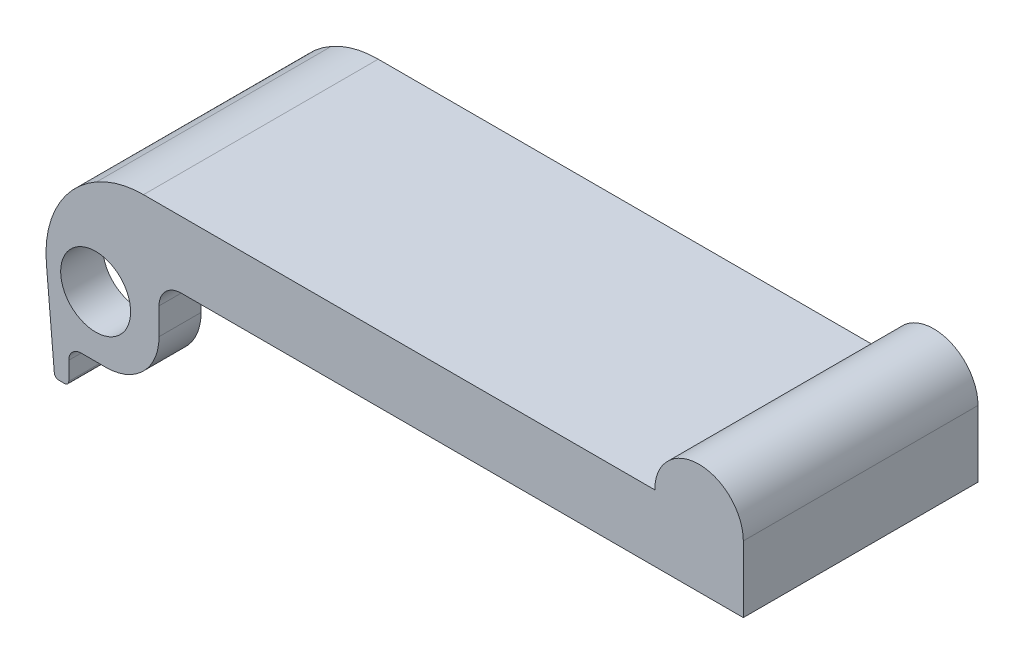
ISO-10303-21;
HEADER;
FILE_DESCRIPTION(('STEP AP214'),'2;1');
FILE_NAME('part.step','',(''),(''),'','','');
FILE_SCHEMA(('AUTOMOTIVE_DESIGN { 1 0 10303 214 1 1 1 1 }'));
ENDSEC;
DATA;
#1=APPLICATION_CONTEXT('core data for automotive mechanical design processes');
#2=APPLICATION_PROTOCOL_DEFINITION('international standard','automotive_design',2000,#1);
#3=PRODUCT_CONTEXT('',#1,'mechanical');
#4=PRODUCT('Part','Part','',(#3));
#5=PRODUCT_RELATED_PRODUCT_CATEGORY('part','',(#4));
#6=PRODUCT_DEFINITION_FORMATION('','',#4);
#7=PRODUCT_DEFINITION_CONTEXT('part definition',#1,'design');
#8=PRODUCT_DEFINITION('design','',#6,#7);
#9=PRODUCT_DEFINITION_SHAPE('','',#8);
#10=(LENGTH_UNIT() NAMED_UNIT(*) SI_UNIT(.MILLI.,.METRE.));
#11=(NAMED_UNIT(*) PLANE_ANGLE_UNIT() SI_UNIT($,.RADIAN.));
#12=(NAMED_UNIT(*) SI_UNIT($,.STERADIAN.) SOLID_ANGLE_UNIT());
#13=UNCERTAINTY_MEASURE_WITH_UNIT(LENGTH_MEASURE(1.E-05),#10,'distance_accuracy_value','');
#14=(GEOMETRIC_REPRESENTATION_CONTEXT(3) GLOBAL_UNCERTAINTY_ASSIGNED_CONTEXT((#13)) GLOBAL_UNIT_ASSIGNED_CONTEXT((#10,
#11,#12)) REPRESENTATION_CONTEXT('',''));
#15=CARTESIAN_POINT('',(0.,0.,0.));
#16=DIRECTION('',(0.,0.,1.));
#17=DIRECTION('',(1.,0.,0.));
#18=AXIS2_PLACEMENT_3D('',#15,#16,#17);
#19=CARTESIAN_POINT('',(0.327576825053643,-0.324192991626943,2.65));
#20=DIRECTION('',(0.,0.,-1.));
#21=DIRECTION('',(-1.,0.,0.));
#22=AXIS2_PLACEMENT_3D('',#19,#20,#21);
#23=CYLINDRICAL_SURFACE('',#22,1.07419299162694);
#24=CARTESIAN_POINT('',(0.327576825053643,-0.324192991626943,2.65));
#25=DIRECTION('',(0.,0.,-1.));
#26=DIRECTION('',(-1.,0.,0.));
#27=AXIS2_PLACEMENT_3D('',#24,#25,#26);
#28=CIRCLE('',#27,1.07419299162694);
#29=CARTESIAN_POINT('',(-0.201836000662828,0.610479487494671,2.65));
#30=VERTEX_POINT('',#29);
#31=CARTESIAN_POINT('',(0.327576825053643,0.75,2.65));
#32=VERTEX_POINT('',#31);
#33=EDGE_CURVE('E217',#30,#32,#28,.T.);
#34=ORIENTED_EDGE('',*,*,#33,.T.);
#35=DIRECTION('',(0.,0.,1.));
#36=VECTOR('',#35,1.);
#37=CARTESIAN_POINT('',(0.327576825053643,0.75,2.65));
#38=LINE('',#37,#36);
#39=CARTESIAN_POINT('',(0.327576825053643,0.75,0.));
#40=VERTEX_POINT('',#39);
#41=EDGE_CURVE('E324',#32,#40,#38,.F.);
#42=ORIENTED_EDGE('',*,*,#41,.T.);
#43=CARTESIAN_POINT('',(0.327576825053643,-0.324192991626943,0.));
#44=DIRECTION('',(0.,0.,-1.));
#45=DIRECTION('',(-1.,0.,0.));
#46=AXIS2_PLACEMENT_3D('',#43,#44,#45);
#47=CIRCLE('',#46,1.07419299162694);
#48=CARTESIAN_POINT('',(-0.201836000662828,0.610479487494671,0.));
#49=VERTEX_POINT('',#48);
#50=EDGE_CURVE('E20',#40,#49,#47,.F.);
#51=ORIENTED_EDGE('',*,*,#50,.T.);
#52=DIRECTION('',(0.,0.,-1.));
#53=VECTOR('',#52,1.);
#54=CARTESIAN_POINT('',(-0.201836000662828,0.610479487494671,2.65));
#55=LINE('',#54,#53);
#56=EDGE_CURVE('E206',#49,#30,#55,.F.);
#57=ORIENTED_EDGE('',*,*,#56,.T.);
#58=EDGE_LOOP('',(#34,#42,#51,#57));
#59=FACE_BOUND('',#58,.T.);
#60=ADVANCED_FACE('F17',(#59),#23,.T.);
#61=CARTESIAN_POINT('',(6.6,0.75,2.65));
#62=DIRECTION('',(0.,0.,-1.));
#63=DIRECTION('',(-1.,0.,0.));
#64=AXIS2_PLACEMENT_3D('',#61,#62,#63);
#65=CYLINDRICAL_SURFACE('',#64,0.5);
#66=CARTESIAN_POINT('',(6.6,0.75,2.65));
#67=DIRECTION('',(0.,0.,-1.));
#68=DIRECTION('',(-1.,0.,0.));
#69=AXIS2_PLACEMENT_3D('',#66,#67,#68);
#70=CIRCLE('',#69,0.5);
#71=CARTESIAN_POINT('',(7.1,0.75,2.65));
#72=VERTEX_POINT('',#71);
#73=CARTESIAN_POINT('',(6.1,0.75,2.65));
#74=VERTEX_POINT('',#73);
#75=EDGE_CURVE('E228',#72,#74,#70,.F.);
#76=ORIENTED_EDGE('',*,*,#75,.F.);
#77=DIRECTION('',(0.,0.,1.));
#78=VECTOR('',#77,1.);
#79=CARTESIAN_POINT('',(7.1,0.75,2.65));
#80=LINE('',#79,#78);
#81=CARTESIAN_POINT('',(7.1,0.75,0.));
#82=VERTEX_POINT('',#81);
#83=EDGE_CURVE('E329',#72,#82,#80,.F.);
#84=ORIENTED_EDGE('',*,*,#83,.T.);
#85=CARTESIAN_POINT('',(6.6,0.75,0.));
#86=DIRECTION('',(0.,0.,-1.));
#87=DIRECTION('',(-1.,0.,0.));
#88=AXIS2_PLACEMENT_3D('',#85,#86,#87);
#89=CIRCLE('',#88,0.5);
#90=CARTESIAN_POINT('',(6.1,0.75,0.));
#91=VERTEX_POINT('',#90);
#92=EDGE_CURVE('E224',#82,#91,#89,.F.);
#93=ORIENTED_EDGE('',*,*,#92,.T.);
#94=DIRECTION('',(0.,0.,1.));
#95=VECTOR('',#94,1.);
#96=CARTESIAN_POINT('',(6.1,0.75,2.65));
#97=LINE('',#96,#95);
#98=EDGE_CURVE('E225',#91,#74,#97,.T.);
#99=ORIENTED_EDGE('',*,*,#98,.T.);
#100=EDGE_LOOP('',(#76,#84,#93,#99));
#101=FACE_BOUND('',#100,.T.);
#102=ADVANCED_FACE('F533',(#101),#65,.T.);
#103=CARTESIAN_POINT('',(6.1,0.75,2.65));
#104=DIRECTION('',(0.,-1.,0.));
#105=DIRECTION('',(1.,0.,0.));
#106=AXIS2_PLACEMENT_3D('',#103,#104,#105);
#107=PLANE('',#106);
#108=ORIENTED_EDGE('',*,*,#41,.F.);
#109=DIRECTION('',(1.,0.,0.));
#110=VECTOR('',#109,1.);
#111=CARTESIAN_POINT('',(6.6,0.75,2.65));
#112=LINE('',#111,#110);
#113=EDGE_CURVE('E213',#74,#32,#112,.F.);
#114=ORIENTED_EDGE('',*,*,#113,.F.);
#115=ORIENTED_EDGE('',*,*,#98,.F.);
#116=DIRECTION('',(1.,0.,0.));
#117=VECTOR('',#116,1.);
#118=CARTESIAN_POINT('',(6.6,0.75,0.));
#119=LINE('',#118,#117);
#120=EDGE_CURVE('E252',#91,#40,#119,.F.);
#121=ORIENTED_EDGE('',*,*,#120,.T.);
#122=EDGE_LOOP('',(#108,#114,#115,#121));
#123=FACE_BOUND('',#122,.T.);
#124=ADVANCED_FACE('F535',(#123),#107,.F.);
#125=CARTESIAN_POINT('',(-0.213279237845057,-0.469266175004195,2.65));
#126=DIRECTION('',(0.,0.,-1.));
#127=DIRECTION('',(-1.,0.,0.));
#128=AXIS2_PLACEMENT_3D('',#125,#126,#127);
#129=CYLINDRICAL_SURFACE('',#128,0.395);
#130=CARTESIAN_POINT('',(-0.213279237845057,-0.469266175004195,0.475));
#131=DIRECTION('',(0.,0.,-1.));
#132=DIRECTION('',(-1.,0.,0.));
#133=AXIS2_PLACEMENT_3D('',#130,#131,#132);
#134=CIRCLE('',#133,0.395);
#135=CARTESIAN_POINT('',(-0.608279237845057,-0.469266175004195,0.475));
#136=VERTEX_POINT('',#135);
#137=EDGE_CURVE('E277',#136,#136,#134,.T.);
#138=ORIENTED_EDGE('',*,*,#137,.F.);
#139=EDGE_LOOP('',(#138));
#140=FACE_BOUND('',#139,.T.);
#141=CARTESIAN_POINT('',(-0.213279237845057,-0.469266175004195,0.));
#142=DIRECTION('',(0.,0.,-1.));
#143=DIRECTION('',(-1.,0.,0.));
#144=AXIS2_PLACEMENT_3D('',#141,#142,#143);
#145=CIRCLE('',#144,0.395);
#146=CARTESIAN_POINT('',(-0.608279237845057,-0.469266175004195,0.));
#147=VERTEX_POINT('',#146);
#148=EDGE_CURVE('E269',#147,#147,#145,.T.);
#149=ORIENTED_EDGE('',*,*,#148,.T.);
#150=EDGE_LOOP('',(#149));
#151=FACE_BOUND('',#150,.T.);
#152=ADVANCED_FACE('F537',(#140,#151),#129,.F.);
#153=CARTESIAN_POINT('',(-0.769582287093294,-0.469266175004243,2.65));
#154=DIRECTION('',(0.996194698091746,0.0871557427476522,0.));
#155=DIRECTION('',(-0.0871557427476522,0.996194698091746,0.));
#156=AXIS2_PLACEMENT_3D('',#153,#154,#155);
#157=PLANE('',#156);
#158=DIRECTION('',(0.,0.,1.));
#159=VECTOR('',#158,1.);
#160=CARTESIAN_POINT('',(-0.769582287093294,-0.469266175004244,2.65));
#161=LINE('',#160,#159);
#162=CARTESIAN_POINT('',(-0.769582287093294,-0.469266175004244,0.));
#163=VERTEX_POINT('',#162);
#164=CARTESIAN_POINT('',(-0.769582287093294,-0.469266175004243,0.475));
#165=VERTEX_POINT('',#164);
#166=EDGE_CURVE('E326',#163,#165,#161,.T.);
#167=ORIENTED_EDGE('',*,*,#166,.F.);
#168=DIRECTION('',(0.0871557427476525,-0.996194698091746,0.));
#169=VECTOR('',#168,1.);
#170=CARTESIAN_POINT('',(-0.769582287093294,-0.469266175004244,0.));
#171=LINE('',#170,#169);
#172=CARTESIAN_POINT('',(-0.679633244608518,-1.4973884351886,0.));
#173=VERTEX_POINT('',#172);
#174=EDGE_CURVE('E251',#163,#173,#171,.T.);
#175=ORIENTED_EDGE('',*,*,#174,.T.);
#176=DIRECTION('',(0.,0.,-1.));
#177=VECTOR('',#176,1.);
#178=CARTESIAN_POINT('',(-0.679633244608518,-1.4973884351886,2.65));
#179=LINE('',#178,#177);
#180=CARTESIAN_POINT('',(-0.679633244608518,-1.4973884351886,0.475));
#181=VERTEX_POINT('',#180);
#182=EDGE_CURVE('E334',#181,#173,#179,.T.);
#183=ORIENTED_EDGE('',*,*,#182,.F.);
#184=DIRECTION('',(0.0871557427476521,-0.996194698091746,0.));
#185=VECTOR('',#184,1.);
#186=CARTESIAN_POINT('',(-0.769582287093294,-0.469266175004244,0.475));
#187=LINE('',#186,#185);
#188=EDGE_CURVE('E282',#165,#181,#187,.T.);
#189=ORIENTED_EDGE('',*,*,#188,.F.);
#190=EDGE_LOOP('',(#167,#175,#183,#189));
#191=FACE_BOUND('',#190,.T.);
#192=ADVANCED_FACE('F543',(#191),#157,.F.);
#193=CARTESIAN_POINT('',(-0.630173917395969,-1.49306130475188,2.65));
#194=DIRECTION('',(0.,0.,-1.));
#195=DIRECTION('',(-1.,0.,0.));
#196=AXIS2_PLACEMENT_3D('',#193,#194,#195);
#197=CYLINDRICAL_SURFACE('',#196,0.0496482538075041);
#198=CARTESIAN_POINT('',(-0.630173917395969,-1.49306130475188,0.));
#199=DIRECTION('',(0.,0.,-1.));
#200=DIRECTION('',(-1.,0.,0.));
#201=AXIS2_PLACEMENT_3D('',#198,#199,#200);
#202=CIRCLE('',#201,0.0496482538075041);
#203=CARTESIAN_POINT('',(-0.630173917395969,-1.54270955855939,0.));
#204=VERTEX_POINT('',#203);
#205=EDGE_CURVE('E253',#173,#204,#202,.F.);
#206=ORIENTED_EDGE('',*,*,#205,.T.);
#207=DIRECTION('',(0.,0.,1.));
#208=VECTOR('',#207,1.);
#209=CARTESIAN_POINT('',(-0.630173917395969,-1.54270955855939,2.65));
#210=LINE('',#209,#208);
#211=CARTESIAN_POINT('',(-0.630173917395969,-1.54270955855939,0.475));
#212=VERTEX_POINT('',#211);
#213=EDGE_CURVE('E336',#204,#212,#210,.T.);
#214=ORIENTED_EDGE('',*,*,#213,.T.);
#215=CARTESIAN_POINT('',(-0.630173917395969,-1.49306130475188,0.475));
#216=DIRECTION('',(0.,0.,-1.));
#217=DIRECTION('',(-1.,0.,0.));
#218=AXIS2_PLACEMENT_3D('',#215,#216,#217);
#219=CIRCLE('',#218,0.0496482538075041);
#220=EDGE_CURVE('E283',#181,#212,#219,.F.);
#221=ORIENTED_EDGE('',*,*,#220,.F.);
#222=ORIENTED_EDGE('',*,*,#182,.T.);
#223=EDGE_LOOP('',(#206,#214,#221,#222));
#224=FACE_BOUND('',#223,.T.);
#225=ADVANCED_FACE('F549',(#224),#197,.T.);
#226=CARTESIAN_POINT('',(-0.630173917395969,-1.54270955855939,2.65));
#227=DIRECTION('',(0.,1.,0.));
#228=DIRECTION('',(0.,0.,1.));
#229=AXIS2_PLACEMENT_3D('',#226,#227,#228);
#230=PLANE('',#229);
#231=ORIENTED_EDGE('',*,*,#213,.F.);
#232=DIRECTION('',(1.,0.,0.));
#233=VECTOR('',#232,1.);
#234=CARTESIAN_POINT('',(6.6,-1.54270955855939,0.));
#235=LINE('',#234,#233);
#236=CARTESIAN_POINT('',(-0.561705820494194,-1.54270955855939,0.));
#237=VERTEX_POINT('',#236);
#238=EDGE_CURVE('E256',#204,#237,#235,.T.);
#239=ORIENTED_EDGE('',*,*,#238,.T.);
#240=DIRECTION('',(0.,0.,-1.));
#241=VECTOR('',#240,1.);
#242=CARTESIAN_POINT('',(-0.561705820494194,-1.54270955855939,2.65));
#243=LINE('',#242,#241);
#244=CARTESIAN_POINT('',(-0.561705820494194,-1.54270955855939,0.475));
#245=VERTEX_POINT('',#244);
#246=EDGE_CURVE('E339',#245,#237,#243,.T.);
#247=ORIENTED_EDGE('',*,*,#246,.F.);
#248=DIRECTION('',(1.,0.,0.));
#249=VECTOR('',#248,1.);
#250=CARTESIAN_POINT('',(0.944772625151747,-1.54270955855939,0.475));
#251=LINE('',#250,#249);
#252=EDGE_CURVE('E285',#212,#245,#251,.T.);
#253=ORIENTED_EDGE('',*,*,#252,.F.);
#254=EDGE_LOOP('',(#231,#239,#247,#253));
#255=FACE_BOUND('',#254,.T.);
#256=ADVANCED_FACE('F553',(#255),#230,.F.);
#257=CARTESIAN_POINT('',(-0.561705820494194,-1.49780157775307,2.65));
#258=DIRECTION('',(0.,0.,-1.));
#259=DIRECTION('',(-1.,0.,0.));
#260=AXIS2_PLACEMENT_3D('',#257,#258,#259);
#261=CYLINDRICAL_SURFACE('',#260,0.0449079808063136);
#262=CARTESIAN_POINT('',(-0.561705820494194,-1.49780157775307,0.));
#263=DIRECTION('',(0.,0.,-1.));
#264=DIRECTION('',(-1.,0.,0.));
#265=AXIS2_PLACEMENT_3D('',#262,#263,#264);
#266=CIRCLE('',#265,0.0449079808063136);
#267=CARTESIAN_POINT('',(-0.51679783968788,-1.49780157775307,0.));
#268=VERTEX_POINT('',#267);
#269=EDGE_CURVE('E257',#237,#268,#266,.F.);
#270=ORIENTED_EDGE('',*,*,#269,.T.);
#271=DIRECTION('',(0.,0.,1.));
#272=VECTOR('',#271,1.);
#273=CARTESIAN_POINT('',(-0.51679783968788,-1.49780157775307,2.65));
#274=LINE('',#273,#272);
#275=CARTESIAN_POINT('',(-0.51679783968788,-1.49780157775307,0.475));
#276=VERTEX_POINT('',#275);
#277=EDGE_CURVE('E341',#268,#276,#274,.T.);
#278=ORIENTED_EDGE('',*,*,#277,.T.);
#279=CARTESIAN_POINT('',(-0.561705820494194,-1.49780157775307,0.475));
#280=DIRECTION('',(0.,0.,-1.));
#281=DIRECTION('',(-1.,0.,0.));
#282=AXIS2_PLACEMENT_3D('',#279,#280,#281);
#283=CIRCLE('',#282,0.0449079808063136);
#284=EDGE_CURVE('E286',#245,#276,#283,.F.);
#285=ORIENTED_EDGE('',*,*,#284,.F.);
#286=ORIENTED_EDGE('',*,*,#246,.T.);
#287=EDGE_LOOP('',(#270,#278,#285,#286));
#288=FACE_BOUND('',#287,.T.);
#289=ADVANCED_FACE('F557',(#288),#261,.T.);
#290=CARTESIAN_POINT('',(-0.51679783968788,-1.49780157775307,2.65));
#291=DIRECTION('',(-1.,0.,0.));
#292=DIRECTION('',(0.,0.,1.));
#293=AXIS2_PLACEMENT_3D('',#290,#291,#292);
#294=PLANE('',#293);
#295=ORIENTED_EDGE('',*,*,#277,.F.);
#296=DIRECTION('',(0.,1.,0.));
#297=VECTOR('',#296,1.);
#298=CARTESIAN_POINT('',(-0.51679783968788,0.75,0.));
#299=LINE('',#298,#297);
#300=CARTESIAN_POINT('',(-0.51679783968788,-1.29134759021781,0.));
#301=VERTEX_POINT('',#300);
#302=EDGE_CURVE('E260',#268,#301,#299,.T.);
#303=ORIENTED_EDGE('',*,*,#302,.T.);
#304=DIRECTION('',(0.,0.,-1.));
#305=VECTOR('',#304,1.);
#306=CARTESIAN_POINT('',(-0.51679783968788,-1.29134759021781,2.65));
#307=LINE('',#306,#305);
#308=CARTESIAN_POINT('',(-0.51679783968788,-1.29134759021781,0.475));
#309=VERTEX_POINT('',#308);
#310=EDGE_CURVE('E344',#301,#309,#307,.F.);
#311=ORIENTED_EDGE('',*,*,#310,.T.);
#312=DIRECTION('',(0.,1.,0.));
#313=VECTOR('',#312,1.);
#314=CARTESIAN_POINT('',(-0.51679783968788,-2.5,0.475));
#315=LINE('',#314,#313);
#316=EDGE_CURVE('E288',#276,#309,#315,.T.);
#317=ORIENTED_EDGE('',*,*,#316,.F.);
#318=EDGE_LOOP('',(#295,#303,#311,#317));
#319=FACE_BOUND('',#318,.T.);
#320=ADVANCED_FACE('F561',(#319),#294,.F.);
#321=CARTESIAN_POINT('',(-0.376716709379733,-1.29134759021781,2.65));
#322=DIRECTION('',(0.,0.,-1.));
#323=DIRECTION('',(-1.,0.,0.));
#324=AXIS2_PLACEMENT_3D('',#321,#322,#323);
#325=CYLINDRICAL_SURFACE('',#324,0.140081130308147);
#326=ORIENTED_EDGE('',*,*,#310,.F.);
#327=CARTESIAN_POINT('',(-0.376716709379733,-1.29134759021781,0.));
#328=DIRECTION('',(0.,0.,-1.));
#329=DIRECTION('',(-1.,0.,0.));
#330=AXIS2_PLACEMENT_3D('',#327,#328,#329);
#331=CIRCLE('',#330,0.140081130308147);
#332=CARTESIAN_POINT('',(-0.376716709379733,-1.15126645990967,0.));
#333=VERTEX_POINT('',#332);
#334=EDGE_CURVE('E261',#301,#333,#331,.T.);
#335=ORIENTED_EDGE('',*,*,#334,.T.);
#336=DIRECTION('',(0.,0.,1.));
#337=VECTOR('',#336,1.);
#338=CARTESIAN_POINT('',(-0.376716709379733,-1.15126645990967,2.65));
#339=LINE('',#338,#337);
#340=CARTESIAN_POINT('',(-0.376716709379733,-1.15126645990967,0.475));
#341=VERTEX_POINT('',#340);
#342=EDGE_CURVE('E347',#333,#341,#339,.T.);
#343=ORIENTED_EDGE('',*,*,#342,.T.);
#344=CARTESIAN_POINT('',(-0.376716709379733,-1.29134759021781,0.475));
#345=DIRECTION('',(0.,0.,-1.));
#346=DIRECTION('',(-1.,0.,0.));
#347=AXIS2_PLACEMENT_3D('',#344,#345,#346);
#348=CIRCLE('',#347,0.140081130308147);
#349=EDGE_CURVE('E289',#309,#341,#348,.T.);
#350=ORIENTED_EDGE('',*,*,#349,.F.);
#351=EDGE_LOOP('',(#326,#335,#343,#350));
#352=FACE_BOUND('',#351,.T.);
#353=ADVANCED_FACE('F565',(#352),#325,.F.);
#354=CARTESIAN_POINT('',(-0.376716709379733,-1.15126645990967,2.65));
#355=DIRECTION('',(0.,1.,0.));
#356=DIRECTION('',(-1.,0.,0.));
#357=AXIS2_PLACEMENT_3D('',#354,#355,#356);
#358=PLANE('',#357);
#359=ORIENTED_EDGE('',*,*,#342,.F.);
#360=DIRECTION('',(1.,0.,0.));
#361=VECTOR('',#360,1.);
#362=CARTESIAN_POINT('',(6.6,-1.15126645990967,0.));
#363=LINE('',#362,#361);
#364=CARTESIAN_POINT('',(-0.0971924975737658,-1.15126645990967,0.));
#365=VERTEX_POINT('',#364);
#366=EDGE_CURVE('E264',#333,#365,#363,.T.);
#367=ORIENTED_EDGE('',*,*,#366,.T.);
#368=DIRECTION('',(0.,0.,-1.));
#369=VECTOR('',#368,1.);
#370=CARTESIAN_POINT('',(-0.0971924975737658,-1.15126645990967,2.65));
#371=LINE('',#370,#369);
#372=CARTESIAN_POINT('',(-0.0971924975737658,-1.15126645990967,0.475));
#373=VERTEX_POINT('',#372);
#374=EDGE_CURVE('E350',#373,#365,#371,.T.);
#375=ORIENTED_EDGE('',*,*,#374,.F.);
#376=DIRECTION('',(1.,0.,0.));
#377=VECTOR('',#376,1.);
#378=CARTESIAN_POINT('',(0.944772625151747,-1.15126645990967,0.475));
#379=LINE('',#378,#377);
#380=EDGE_CURVE('E291',#341,#373,#379,.T.);
#381=ORIENTED_EDGE('',*,*,#380,.F.);
#382=EDGE_LOOP('',(#359,#367,#375,#381));
#383=FACE_BOUND('',#382,.T.);
#384=ADVANCED_FACE('F569',(#383),#358,.F.);
#385=CARTESIAN_POINT('',(-0.0971924975737659,-0.551266459909666,2.65));
#386=DIRECTION('',(0.,0.,-1.));
#387=DIRECTION('',(-1.,0.,0.));
#388=AXIS2_PLACEMENT_3D('',#385,#386,#387);
#389=CYLINDRICAL_SURFACE('',#388,0.6);
#390=CARTESIAN_POINT('',(-0.0971924975737659,-0.551266459909666,0.));
#391=DIRECTION('',(0.,0.,-1.));
#392=DIRECTION('',(-1.,0.,0.));
#393=AXIS2_PLACEMENT_3D('',#390,#391,#392);
#394=CIRCLE('',#393,0.6);
#395=CARTESIAN_POINT('',(0.502807502426234,-0.551266459909666,0.));
#396=VERTEX_POINT('',#395);
#397=EDGE_CURVE('E265',#365,#396,#394,.F.);
#398=ORIENTED_EDGE('',*,*,#397,.T.);
#399=DIRECTION('',(0.,0.,1.));
#400=VECTOR('',#399,1.);
#401=CARTESIAN_POINT('',(0.502807502426234,-0.551266459909666,2.65));
#402=LINE('',#401,#400);
#403=CARTESIAN_POINT('',(0.502807502426234,-0.551266459909666,0.475));
#404=VERTEX_POINT('',#403);
#405=EDGE_CURVE('E352',#396,#404,#402,.T.);
#406=ORIENTED_EDGE('',*,*,#405,.T.);
#407=CARTESIAN_POINT('',(-0.0971924975737659,-0.551266459909666,0.475));
#408=DIRECTION('',(0.,0.,-1.));
#409=DIRECTION('',(-1.,0.,0.));
#410=AXIS2_PLACEMENT_3D('',#407,#408,#409);
#411=CIRCLE('',#410,0.6);
#412=EDGE_CURVE('E292',#373,#404,#411,.F.);
#413=ORIENTED_EDGE('',*,*,#412,.F.);
#414=ORIENTED_EDGE('',*,*,#374,.T.);
#415=EDGE_LOOP('',(#398,#406,#413,#414));
#416=FACE_BOUND('',#415,.T.);
#417=ADVANCED_FACE('F573',(#416),#389,.T.);
#418=CARTESIAN_POINT('',(0.502807502426234,-0.551266459909666,2.65));
#419=DIRECTION('',(-1.,0.,0.));
#420=DIRECTION('',(0.,-1.,0.));
#421=AXIS2_PLACEMENT_3D('',#418,#419,#420);
#422=PLANE('',#421);
#423=ORIENTED_EDGE('',*,*,#405,.F.);
#424=DIRECTION('',(0.,1.,0.));
#425=VECTOR('',#424,1.);
#426=CARTESIAN_POINT('',(0.502807502426234,0.75,0.));
#427=LINE('',#426,#425);
#428=CARTESIAN_POINT('',(0.502807502426233,-0.25,0.));
#429=VERTEX_POINT('',#428);
#430=EDGE_CURVE('E268',#396,#429,#427,.T.);
#431=ORIENTED_EDGE('',*,*,#430,.T.);
#432=DIRECTION('',(0.,0.,-1.));
#433=VECTOR('',#432,1.);
#434=CARTESIAN_POINT('',(0.502807502426231,-0.25,2.65));
#435=LINE('',#434,#433);
#436=CARTESIAN_POINT('',(0.502807502426233,-0.25,0.475));
#437=VERTEX_POINT('',#436);
#438=EDGE_CURVE('E276',#429,#437,#435,.F.);
#439=ORIENTED_EDGE('',*,*,#438,.T.);
#440=DIRECTION('',(0.,1.,0.));
#441=VECTOR('',#440,1.);
#442=CARTESIAN_POINT('',(0.502807502426234,-2.5,0.475));
#443=LINE('',#442,#441);
#444=EDGE_CURVE('E294',#404,#437,#443,.T.);
#445=ORIENTED_EDGE('',*,*,#444,.F.);
#446=EDGE_LOOP('',(#423,#431,#439,#445));
#447=FACE_BOUND('',#446,.T.);
#448=ADVANCED_FACE('F577',(#447),#422,.F.);
#449=CARTESIAN_POINT('',(-0.213279237845057,-0.469266175004195,2.65));
#450=DIRECTION('',(0.,0.,-1.));
#451=DIRECTION('',(-1.,0.,0.));
#452=AXIS2_PLACEMENT_3D('',#449,#450,#451);
#453=CYLINDRICAL_SURFACE('',#452,0.395);
#454=CARTESIAN_POINT('',(-0.213279237845057,-0.469266175004195,2.175));
#455=DIRECTION('',(0.,0.,-1.));
#456=DIRECTION('',(-1.,0.,0.));
#457=AXIS2_PLACEMENT_3D('',#454,#455,#456);
#458=CIRCLE('',#457,0.395);
#459=CARTESIAN_POINT('',(-0.608279237845057,-0.469266175004195,2.175));
#460=VERTEX_POINT('',#459);
#461=EDGE_CURVE('E297',#460,#460,#458,.F.);
#462=ORIENTED_EDGE('',*,*,#461,.F.);
#463=EDGE_LOOP('',(#462));
#464=FACE_BOUND('',#463,.T.);
#465=CARTESIAN_POINT('',(-0.213279237845057,-0.469266175004195,2.65));
#466=DIRECTION('',(0.,0.,-1.));
#467=DIRECTION('',(-1.,0.,0.));
#468=AXIS2_PLACEMENT_3D('',#465,#466,#467);
#469=CIRCLE('',#468,0.395);
#470=CARTESIAN_POINT('',(-0.608279237845057,-0.469266175004195,2.65));
#471=VERTEX_POINT('',#470);
#472=EDGE_CURVE('E246',#471,#471,#469,.T.);
#473=ORIENTED_EDGE('',*,*,#472,.F.);
#474=EDGE_LOOP('',(#473));
#475=FACE_BOUND('',#474,.T.);
#476=ADVANCED_FACE('F581',(#464,#475),#453,.F.);
#477=CARTESIAN_POINT('',(0.354066189715127,-0.370959671495341,2.65));
#478=DIRECTION('',(0.,0.,-1.));
#479=DIRECTION('',(-1.,0.,0.));
#480=AXIS2_PLACEMENT_3D('',#477,#478,#479);
#481=CYLINDRICAL_SURFACE('',#480,1.12794063144566);
#482=CARTESIAN_POINT('',(0.354066189715127,-0.370959671495341,2.175));
#483=DIRECTION('',(0.,0.,-1.));
#484=DIRECTION('',(-1.,0.,0.));
#485=AXIS2_PLACEMENT_3D('',#482,#483,#484);
#486=CIRCLE('',#485,1.12794063144566);
#487=CARTESIAN_POINT('',(-0.769582287093294,-0.469266175004243,2.175));
#488=VERTEX_POINT('',#487);
#489=CARTESIAN_POINT('',(-0.711128154144292,0.,2.175));
#490=VERTEX_POINT('',#489);
#491=EDGE_CURVE('E300',#488,#490,#486,.T.);
#492=ORIENTED_EDGE('',*,*,#491,.F.);
#493=DIRECTION('',(0.,0.,1.));
#494=VECTOR('',#493,1.);
#495=CARTESIAN_POINT('',(-0.769582287093294,-0.469266175004244,2.65));
#496=LINE('',#495,#494);
#497=CARTESIAN_POINT('',(-0.769582287093294,-0.469266175004244,2.65));
#498=VERTEX_POINT('',#497);
#499=EDGE_CURVE('E207',#488,#498,#496,.T.);
#500=ORIENTED_EDGE('',*,*,#499,.T.);
#501=CARTESIAN_POINT('',(0.354066189715127,-0.370959671495341,2.65));
#502=DIRECTION('',(0.,0.,-1.));
#503=DIRECTION('',(-1.,0.,0.));
#504=AXIS2_PLACEMENT_3D('',#501,#502,#503);
#505=CIRCLE('',#504,1.12794063144566);
#506=EDGE_CURVE('E202',#30,#498,#505,.F.);
#507=ORIENTED_EDGE('',*,*,#506,.F.);
#508=ORIENTED_EDGE('',*,*,#56,.F.);
#509=CARTESIAN_POINT('',(0.354066189715127,-0.370959671495341,0.));
#510=DIRECTION('',(0.,0.,-1.));
#511=DIRECTION('',(-1.,0.,0.));
#512=AXIS2_PLACEMENT_3D('',#509,#510,#511);
#513=CIRCLE('',#512,1.12794063144566);
#514=EDGE_CURVE('E196',#49,#163,#513,.F.);
#515=ORIENTED_EDGE('',*,*,#514,.T.);
#516=ORIENTED_EDGE('',*,*,#166,.T.);
#517=CARTESIAN_POINT('',(0.354066189715127,-0.370959671495341,0.475));
#518=DIRECTION('',(0.,0.,-1.));
#519=DIRECTION('',(-1.,0.,0.));
#520=AXIS2_PLACEMENT_3D('',#517,#518,#519);
#521=CIRCLE('',#520,1.12794063144566);
#522=CARTESIAN_POINT('',(-0.711128154144292,0.,0.475));
#523=VERTEX_POINT('',#522);
#524=EDGE_CURVE('E280',#523,#165,#521,.F.);
#525=ORIENTED_EDGE('',*,*,#524,.F.);
#526=DIRECTION('',(0.,0.,-1.));
#527=VECTOR('',#526,1.);
#528=CARTESIAN_POINT('',(-0.711128154144292,0.,2.65));
#529=LINE('',#528,#527);
#530=EDGE_CURVE('E321',#523,#490,#529,.F.);
#531=ORIENTED_EDGE('',*,*,#530,.T.);
#532=EDGE_LOOP('',(#492,#500,#507,#508,#515,#516,#525,#531));
#533=FACE_BOUND('',#532,.T.);
#534=ADVANCED_FACE('F205',(#533),#481,.T.);
#535=CARTESIAN_POINT('',(-0.0971924975737659,-0.551266459909666,2.65));
#536=DIRECTION('',(0.,0.,-1.));
#537=DIRECTION('',(-1.,0.,0.));
#538=AXIS2_PLACEMENT_3D('',#535,#536,#537);
#539=CYLINDRICAL_SURFACE('',#538,0.6);
#540=CARTESIAN_POINT('',(-0.0971924975737659,-0.551266459909666,2.65));
#541=DIRECTION('',(0.,0.,-1.));
#542=DIRECTION('',(-1.,0.,0.));
#543=AXIS2_PLACEMENT_3D('',#540,#541,#542);
#544=CIRCLE('',#543,0.6);
#545=CARTESIAN_POINT('',(-0.097192497573766,-1.15126645990967,2.65));
#546=VERTEX_POINT('',#545);
#547=CARTESIAN_POINT('',(0.502807502426234,-0.551266459909666,2.65));
#548=VERTEX_POINT('',#547);
#549=EDGE_CURVE('E243',#546,#548,#544,.F.);
#550=ORIENTED_EDGE('',*,*,#549,.F.);
#551=DIRECTION('',(0.,0.,1.));
#552=VECTOR('',#551,1.);
#553=CARTESIAN_POINT('',(-0.0971924975737659,-1.15126645990967,2.65));
#554=LINE('',#553,#552);
#555=CARTESIAN_POINT('',(-0.0971924975737659,-1.15126645990967,2.175));
#556=VERTEX_POINT('',#555);
#557=EDGE_CURVE('E355',#546,#556,#554,.F.);
#558=ORIENTED_EDGE('',*,*,#557,.T.);
#559=CARTESIAN_POINT('',(-0.0971924975737659,-0.551266459909666,2.175));
#560=DIRECTION('',(0.,0.,-1.));
#561=DIRECTION('',(-1.,0.,0.));
#562=AXIS2_PLACEMENT_3D('',#559,#560,#561);
#563=CIRCLE('',#562,0.6);
#564=CARTESIAN_POINT('',(0.502807502426233,-0.551266459909666,2.175));
#565=VERTEX_POINT('',#564);
#566=EDGE_CURVE('E303',#565,#556,#563,.T.);
#567=ORIENTED_EDGE('',*,*,#566,.F.);
#568=DIRECTION('',(0.,0.,1.));
#569=VECTOR('',#568,1.);
#570=CARTESIAN_POINT('',(0.502807502426234,-0.551266459909666,2.65));
#571=LINE('',#570,#569);
#572=EDGE_CURVE('E229',#565,#548,#571,.T.);
#573=ORIENTED_EDGE('',*,*,#572,.T.);
#574=EDGE_LOOP('',(#550,#558,#567,#573));
#575=FACE_BOUND('',#574,.T.);
#576=ADVANCED_FACE('F457',(#575),#539,.T.);
#577=CARTESIAN_POINT('',(-0.376716709379733,-1.15126645990967,2.65));
#578=DIRECTION('',(0.,1.,0.));
#579=DIRECTION('',(-1.,0.,0.));
#580=AXIS2_PLACEMENT_3D('',#577,#578,#579);
#581=PLANE('',#580);
#582=ORIENTED_EDGE('',*,*,#557,.F.);
#583=DIRECTION('',(1.,0.,0.));
#584=VECTOR('',#583,1.);
#585=CARTESIAN_POINT('',(6.6,-1.15126645990967,2.65));
#586=LINE('',#585,#584);
#587=CARTESIAN_POINT('',(-0.376716709379733,-1.15126645990967,2.65));
#588=VERTEX_POINT('',#587);
#589=EDGE_CURVE('E242',#588,#546,#586,.T.);
#590=ORIENTED_EDGE('',*,*,#589,.F.);
#591=DIRECTION('',(0.,0.,-1.));
#592=VECTOR('',#591,1.);
#593=CARTESIAN_POINT('',(-0.376716709379733,-1.15126645990967,2.65));
#594=LINE('',#593,#592);
#595=CARTESIAN_POINT('',(-0.376716709379733,-1.15126645990967,2.175));
#596=VERTEX_POINT('',#595);
#597=EDGE_CURVE('E363',#588,#596,#594,.T.);
#598=ORIENTED_EDGE('',*,*,#597,.T.);
#599=DIRECTION('',(-1.,0.,0.));
#600=VECTOR('',#599,1.);
#601=CARTESIAN_POINT('',(0.944772625151746,-1.15126645990967,2.175));
#602=LINE('',#601,#600);
#603=EDGE_CURVE('E305',#556,#596,#602,.T.);
#604=ORIENTED_EDGE('',*,*,#603,.F.);
#605=EDGE_LOOP('',(#582,#590,#598,#604));
#606=FACE_BOUND('',#605,.T.);
#607=ADVANCED_FACE('F462',(#606),#581,.F.);
#608=CARTESIAN_POINT('',(-0.376716709379733,-1.29134759021781,2.65));
#609=DIRECTION('',(0.,0.,-1.));
#610=DIRECTION('',(-1.,0.,0.));
#611=AXIS2_PLACEMENT_3D('',#608,#609,#610);
#612=CYLINDRICAL_SURFACE('',#611,0.140081130308147);
#613=ORIENTED_EDGE('',*,*,#597,.F.);
#614=CARTESIAN_POINT('',(-0.376716709379733,-1.29134759021781,2.65));
#615=DIRECTION('',(0.,0.,-1.));
#616=DIRECTION('',(-1.,0.,0.));
#617=AXIS2_PLACEMENT_3D('',#614,#615,#616);
#618=CIRCLE('',#617,0.140081130308147);
#619=CARTESIAN_POINT('',(-0.51679783968788,-1.29134759021781,2.65));
#620=VERTEX_POINT('',#619);
#621=EDGE_CURVE('E239',#620,#588,#618,.T.);
#622=ORIENTED_EDGE('',*,*,#621,.F.);
#623=DIRECTION('',(0.,0.,1.));
#624=VECTOR('',#623,1.);
#625=CARTESIAN_POINT('',(-0.51679783968788,-1.29134759021781,2.65));
#626=LINE('',#625,#624);
#627=CARTESIAN_POINT('',(-0.51679783968788,-1.29134759021781,2.175));
#628=VERTEX_POINT('',#627);
#629=EDGE_CURVE('E366',#620,#628,#626,.F.);
#630=ORIENTED_EDGE('',*,*,#629,.T.);
#631=CARTESIAN_POINT('',(-0.376716709379733,-1.29134759021781,2.175));
#632=DIRECTION('',(0.,0.,-1.));
#633=DIRECTION('',(-1.,0.,0.));
#634=AXIS2_PLACEMENT_3D('',#631,#632,#633);
#635=CIRCLE('',#634,0.140081130308147);
#636=EDGE_CURVE('E306',#596,#628,#635,.F.);
#637=ORIENTED_EDGE('',*,*,#636,.F.);
#638=EDGE_LOOP('',(#613,#622,#630,#637));
#639=FACE_BOUND('',#638,.T.);
#640=ADVANCED_FACE('F468',(#639),#612,.F.);
#641=CARTESIAN_POINT('',(-0.51679783968788,-1.49780157775307,2.65));
#642=DIRECTION('',(-1.,0.,0.));
#643=DIRECTION('',(0.,0.,1.));
#644=AXIS2_PLACEMENT_3D('',#641,#642,#643);
#645=PLANE('',#644);
#646=ORIENTED_EDGE('',*,*,#629,.F.);
#647=DIRECTION('',(0.,1.,0.));
#648=VECTOR('',#647,1.);
#649=CARTESIAN_POINT('',(-0.51679783968788,0.75,2.65));
#650=LINE('',#649,#648);
#651=CARTESIAN_POINT('',(-0.51679783968788,-1.49780157775307,2.65));
#652=VERTEX_POINT('',#651);
#653=EDGE_CURVE('E238',#652,#620,#650,.T.);
#654=ORIENTED_EDGE('',*,*,#653,.F.);
#655=DIRECTION('',(0.,0.,-1.));
#656=VECTOR('',#655,1.);
#657=CARTESIAN_POINT('',(-0.51679783968788,-1.49780157775307,2.65));
#658=LINE('',#657,#656);
#659=CARTESIAN_POINT('',(-0.51679783968788,-1.49780157775307,2.175));
#660=VERTEX_POINT('',#659);
#661=EDGE_CURVE('E369',#660,#652,#658,.F.);
#662=ORIENTED_EDGE('',*,*,#661,.F.);
#663=DIRECTION('',(0.,1.,0.));
#664=VECTOR('',#663,1.);
#665=CARTESIAN_POINT('',(-0.51679783968788,-2.5,2.175));
#666=LINE('',#665,#664);
#667=EDGE_CURVE('E308',#628,#660,#666,.F.);
#668=ORIENTED_EDGE('',*,*,#667,.F.);
#669=EDGE_LOOP('',(#646,#654,#662,#668));
#670=FACE_BOUND('',#669,.T.);
#671=ADVANCED_FACE('F471',(#670),#645,.F.);
#672=CARTESIAN_POINT('',(-0.561705820494194,-1.49780157775307,2.65));
#673=DIRECTION('',(0.,0.,-1.));
#674=DIRECTION('',(-1.,0.,0.));
#675=AXIS2_PLACEMENT_3D('',#672,#673,#674);
#676=CYLINDRICAL_SURFACE('',#675,0.0449079808063136);
#677=CARTESIAN_POINT('',(-0.561705820494194,-1.49780157775307,2.65));
#678=DIRECTION('',(0.,0.,-1.));
#679=DIRECTION('',(-1.,0.,0.));
#680=AXIS2_PLACEMENT_3D('',#677,#678,#679);
#681=CIRCLE('',#680,0.0449079808063136);
#682=CARTESIAN_POINT('',(-0.561705820494194,-1.54270955855939,2.65));
#683=VERTEX_POINT('',#682);
#684=EDGE_CURVE('E235',#683,#652,#681,.F.);
#685=ORIENTED_EDGE('',*,*,#684,.F.);
#686=DIRECTION('',(0.,0.,1.));
#687=VECTOR('',#686,1.);
#688=CARTESIAN_POINT('',(-0.561705820494194,-1.54270955855939,2.65));
#689=LINE('',#688,#687);
#690=CARTESIAN_POINT('',(-0.561705820494194,-1.54270955855939,2.175));
#691=VERTEX_POINT('',#690);
#692=EDGE_CURVE('E371',#683,#691,#689,.F.);
#693=ORIENTED_EDGE('',*,*,#692,.T.);
#694=CARTESIAN_POINT('',(-0.561705820494194,-1.49780157775307,2.175));
#695=DIRECTION('',(0.,0.,-1.));
#696=DIRECTION('',(-1.,0.,0.));
#697=AXIS2_PLACEMENT_3D('',#694,#695,#696);
#698=CIRCLE('',#697,0.0449079808063136);
#699=EDGE_CURVE('E309',#660,#691,#698,.T.);
#700=ORIENTED_EDGE('',*,*,#699,.F.);
#701=ORIENTED_EDGE('',*,*,#661,.T.);
#702=EDGE_LOOP('',(#685,#693,#700,#701));
#703=FACE_BOUND('',#702,.T.);
#704=ADVANCED_FACE('F475',(#703),#676,.T.);
#705=CARTESIAN_POINT('',(-0.630173917395969,-1.54270955855939,2.65));
#706=DIRECTION('',(0.,1.,0.));
#707=DIRECTION('',(0.,0.,1.));
#708=AXIS2_PLACEMENT_3D('',#705,#706,#707);
#709=PLANE('',#708);
#710=ORIENTED_EDGE('',*,*,#692,.F.);
#711=DIRECTION('',(1.,0.,0.));
#712=VECTOR('',#711,1.);
#713=CARTESIAN_POINT('',(6.6,-1.54270955855939,2.65));
#714=LINE('',#713,#712);
#715=CARTESIAN_POINT('',(-0.630173917395969,-1.54270955855939,2.65));
#716=VERTEX_POINT('',#715);
#717=EDGE_CURVE('E234',#716,#683,#714,.T.);
#718=ORIENTED_EDGE('',*,*,#717,.F.);
#719=DIRECTION('',(0.,0.,-1.));
#720=VECTOR('',#719,1.);
#721=CARTESIAN_POINT('',(-0.630173917395969,-1.54270955855939,2.65));
#722=LINE('',#721,#720);
#723=CARTESIAN_POINT('',(-0.630173917395969,-1.54270955855939,2.175));
#724=VERTEX_POINT('',#723);
#725=EDGE_CURVE('E374',#724,#716,#722,.F.);
#726=ORIENTED_EDGE('',*,*,#725,.F.);
#727=DIRECTION('',(-1.,0.,0.));
#728=VECTOR('',#727,1.);
#729=CARTESIAN_POINT('',(0.944772625151746,-1.54270955855939,2.175));
#730=LINE('',#729,#728);
#731=EDGE_CURVE('E311',#691,#724,#730,.T.);
#732=ORIENTED_EDGE('',*,*,#731,.F.);
#733=EDGE_LOOP('',(#710,#718,#726,#732));
#734=FACE_BOUND('',#733,.T.);
#735=ADVANCED_FACE('F480',(#734),#709,.F.);
#736=CARTESIAN_POINT('',(-0.630173917395969,-1.49306130475188,2.65));
#737=DIRECTION('',(0.,0.,-1.));
#738=DIRECTION('',(-1.,0.,0.));
#739=AXIS2_PLACEMENT_3D('',#736,#737,#738);
#740=CYLINDRICAL_SURFACE('',#739,0.0496482538075041);
#741=CARTESIAN_POINT('',(-0.630173917395969,-1.49306130475188,2.65));
#742=DIRECTION('',(0.,0.,-1.));
#743=DIRECTION('',(-1.,0.,0.));
#744=AXIS2_PLACEMENT_3D('',#741,#742,#743);
#745=CIRCLE('',#744,0.0496482538075041);
#746=CARTESIAN_POINT('',(-0.679633244608518,-1.4973884351886,2.65));
#747=VERTEX_POINT('',#746);
#748=EDGE_CURVE('E231',#747,#716,#745,.F.);
#749=ORIENTED_EDGE('',*,*,#748,.F.);
#750=DIRECTION('',(0.,0.,1.));
#751=VECTOR('',#750,1.);
#752=CARTESIAN_POINT('',(-0.679633244608518,-1.4973884351886,2.65));
#753=LINE('',#752,#751);
#754=CARTESIAN_POINT('',(-0.679633244608518,-1.4973884351886,2.175));
#755=VERTEX_POINT('',#754);
#756=EDGE_CURVE('E360',#747,#755,#753,.F.);
#757=ORIENTED_EDGE('',*,*,#756,.T.);
#758=CARTESIAN_POINT('',(-0.630173917395969,-1.49306130475188,2.175));
#759=DIRECTION('',(0.,0.,-1.));
#760=DIRECTION('',(-1.,0.,0.));
#761=AXIS2_PLACEMENT_3D('',#758,#759,#760);
#762=CIRCLE('',#761,0.0496482538075041);
#763=EDGE_CURVE('E312',#724,#755,#762,.T.);
#764=ORIENTED_EDGE('',*,*,#763,.F.);
#765=ORIENTED_EDGE('',*,*,#725,.T.);
#766=EDGE_LOOP('',(#749,#757,#764,#765));
#767=FACE_BOUND('',#766,.T.);
#768=ADVANCED_FACE('F483',(#767),#740,.T.);
#769=CARTESIAN_POINT('',(-0.769582287093294,-0.469266175004243,2.65));
#770=DIRECTION('',(0.996194698091746,0.0871557427476522,0.));
#771=DIRECTION('',(-0.0871557427476522,0.996194698091746,0.));
#772=AXIS2_PLACEMENT_3D('',#769,#770,#771);
#773=PLANE('',#772);
#774=ORIENTED_EDGE('',*,*,#756,.F.);
#775=DIRECTION('',(0.0871557427476525,-0.996194698091746,0.));
#776=VECTOR('',#775,1.);
#777=CARTESIAN_POINT('',(-0.769582287093294,-0.469266175004244,2.65));
#778=LINE('',#777,#776);
#779=EDGE_CURVE('E212',#498,#747,#778,.T.);
#780=ORIENTED_EDGE('',*,*,#779,.F.);
#781=ORIENTED_EDGE('',*,*,#499,.F.);
#782=DIRECTION('',(-0.0871557427476521,0.996194698091746,0.));
#783=VECTOR('',#782,1.);
#784=CARTESIAN_POINT('',(-0.679633244608518,-1.4973884351886,2.175));
#785=LINE('',#784,#783);
#786=EDGE_CURVE('E314',#755,#488,#785,.T.);
#787=ORIENTED_EDGE('',*,*,#786,.F.);
#788=EDGE_LOOP('',(#774,#780,#781,#787));
#789=FACE_BOUND('',#788,.T.);
#790=ADVANCED_FACE('F484',(#789),#773,.F.);
#791=CARTESIAN_POINT('',(0.502807502426234,-0.551266459909666,2.65));
#792=DIRECTION('',(-1.,0.,0.));
#793=DIRECTION('',(0.,-1.,0.));
#794=AXIS2_PLACEMENT_3D('',#791,#792,#793);
#795=PLANE('',#794);
#796=DIRECTION('',(0.,0.,-1.));
#797=VECTOR('',#796,1.);
#798=CARTESIAN_POINT('',(0.502807502426231,-0.25,2.65));
#799=LINE('',#798,#797);
#800=CARTESIAN_POINT('',(0.502807502426231,-0.25,2.175));
#801=VERTEX_POINT('',#800);
#802=CARTESIAN_POINT('',(0.502807502426233,-0.25,2.65));
#803=VERTEX_POINT('',#802);
#804=EDGE_CURVE('E318',#801,#803,#799,.F.);
#805=ORIENTED_EDGE('',*,*,#804,.T.);
#806=DIRECTION('',(0.,1.,0.));
#807=VECTOR('',#806,1.);
#808=CARTESIAN_POINT('',(0.502807502426234,0.75,2.65));
#809=LINE('',#808,#807);
#810=EDGE_CURVE('E245',#548,#803,#809,.T.);
#811=ORIENTED_EDGE('',*,*,#810,.F.);
#812=ORIENTED_EDGE('',*,*,#572,.F.);
#813=DIRECTION('',(0.,1.,0.));
#814=VECTOR('',#813,1.);
#815=CARTESIAN_POINT('',(0.502807502426231,-2.5,2.175));
#816=LINE('',#815,#814);
#817=EDGE_CURVE('E302',#801,#565,#816,.F.);
#818=ORIENTED_EDGE('',*,*,#817,.F.);
#819=EDGE_LOOP('',(#805,#811,#812,#818));
#820=FACE_BOUND('',#819,.T.);
#821=ADVANCED_FACE('F487',(#820),#795,.F.);
#822=CARTESIAN_POINT('',(6.6,0.75,2.65));
#823=DIRECTION('',(0.,0.,1.));
#824=DIRECTION('',(1.,0.,0.));
#825=AXIS2_PLACEMENT_3D('',#822,#823,#824);
#826=PLANE('',#825);
#827=ORIENTED_EDGE('',*,*,#472,.T.);
#828=EDGE_LOOP('',(#827));
#829=FACE_BOUND('',#828,.T.);
#830=DIRECTION('',(1.,0.,0.));
#831=VECTOR('',#830,1.);
#832=CARTESIAN_POINT('',(0.752807502426231,0.,2.65));
#833=LINE('',#832,#831);
#834=CARTESIAN_POINT('',(0.752807502426231,0.,2.65));
#835=VERTEX_POINT('',#834);
#836=CARTESIAN_POINT('',(7.1,0.,2.65));
#837=VERTEX_POINT('',#836);
#838=EDGE_CURVE('E320',#835,#837,#833,.T.);
#839=ORIENTED_EDGE('',*,*,#838,.T.);
#840=DIRECTION('',(0.,1.,0.));
#841=VECTOR('',#840,1.);
#842=CARTESIAN_POINT('',(7.1,0.,2.65));
#843=LINE('',#842,#841);
#844=EDGE_CURVE('E249',#837,#72,#843,.T.);
#845=ORIENTED_EDGE('',*,*,#844,.T.);
#846=ORIENTED_EDGE('',*,*,#75,.T.);
#847=ORIENTED_EDGE('',*,*,#113,.T.);
#848=ORIENTED_EDGE('',*,*,#33,.F.);
#849=ORIENTED_EDGE('',*,*,#506,.T.);
#850=ORIENTED_EDGE('',*,*,#779,.T.);
#851=ORIENTED_EDGE('',*,*,#748,.T.);
#852=ORIENTED_EDGE('',*,*,#717,.T.);
#853=ORIENTED_EDGE('',*,*,#684,.T.);
#854=ORIENTED_EDGE('',*,*,#653,.T.);
#855=ORIENTED_EDGE('',*,*,#621,.T.);
#856=ORIENTED_EDGE('',*,*,#589,.T.);
#857=ORIENTED_EDGE('',*,*,#549,.T.);
#858=ORIENTED_EDGE('',*,*,#810,.T.);
#859=CARTESIAN_POINT('',(0.752807502426231,-0.25,2.65));
#860=DIRECTION('',(0.,0.,-1.));
#861=DIRECTION('',(-1.,0.,0.));
#862=AXIS2_PLACEMENT_3D('',#859,#860,#861);
#863=CIRCLE('',#862,0.25);
#864=EDGE_CURVE('E315',#803,#835,#863,.T.);
#865=ORIENTED_EDGE('',*,*,#864,.T.);
#866=EDGE_LOOP('',(#839,#845,#846,#847,#848,#849,#850,#851,#852,#853,#854,#855,#856,#857,#858,#865));
#867=FACE_BOUND('',#866,.T.);
#868=ADVANCED_FACE('F222',(#829,#867),#826,.T.);
#869=CARTESIAN_POINT('',(7.1,0.,2.65));
#870=DIRECTION('',(-1.,0.,0.));
#871=DIRECTION('',(0.,0.,1.));
#872=AXIS2_PLACEMENT_3D('',#869,#870,#871);
#873=PLANE('',#872);
#874=ORIENTED_EDGE('',*,*,#83,.F.);
#875=ORIENTED_EDGE('',*,*,#844,.F.);
#876=DIRECTION('',(0.,0.,1.));
#877=VECTOR('',#876,1.);
#878=CARTESIAN_POINT('',(7.1,0.,2.65));
#879=LINE('',#878,#877);
#880=CARTESIAN_POINT('',(7.1,0.,0.));
#881=VERTEX_POINT('',#880);
#882=EDGE_CURVE('E393',#837,#881,#879,.F.);
#883=ORIENTED_EDGE('',*,*,#882,.T.);
#884=DIRECTION('',(0.,1.,0.));
#885=VECTOR('',#884,1.);
#886=CARTESIAN_POINT('',(7.1,0.75,0.));
#887=LINE('',#886,#885);
#888=EDGE_CURVE('E273',#881,#82,#887,.T.);
#889=ORIENTED_EDGE('',*,*,#888,.T.);
#890=EDGE_LOOP('',(#874,#875,#883,#889));
#891=FACE_BOUND('',#890,.T.);
#892=ADVANCED_FACE('F495',(#891),#873,.F.);
#893=CARTESIAN_POINT('',(6.6,0.75,0.));
#894=DIRECTION('',(0.,0.,1.));
#895=DIRECTION('',(1.,0.,0.));
#896=AXIS2_PLACEMENT_3D('',#893,#894,#895);
#897=PLANE('',#896);
#898=ORIENTED_EDGE('',*,*,#148,.F.);
#899=EDGE_LOOP('',(#898));
#900=FACE_BOUND('',#899,.T.);
#901=ORIENTED_EDGE('',*,*,#888,.F.);
#902=DIRECTION('',(1.,0.,0.));
#903=VECTOR('',#902,1.);
#904=CARTESIAN_POINT('',(0.752807502426231,0.,0.));
#905=LINE('',#904,#903);
#906=CARTESIAN_POINT('',(0.752807502426231,0.,0.));
#907=VERTEX_POINT('',#906);
#908=EDGE_CURVE('E402',#881,#907,#905,.F.);
#909=ORIENTED_EDGE('',*,*,#908,.T.);
#910=CARTESIAN_POINT('',(0.752807502426231,-0.25,0.));
#911=DIRECTION('',(0.,0.,-1.));
#912=DIRECTION('',(-1.,0.,0.));
#913=AXIS2_PLACEMENT_3D('',#910,#911,#912);
#914=CIRCLE('',#913,0.25);
#915=EDGE_CURVE('E272',#907,#429,#914,.F.);
#916=ORIENTED_EDGE('',*,*,#915,.T.);
#917=ORIENTED_EDGE('',*,*,#430,.F.);
#918=ORIENTED_EDGE('',*,*,#397,.F.);
#919=ORIENTED_EDGE('',*,*,#366,.F.);
#920=ORIENTED_EDGE('',*,*,#334,.F.);
#921=ORIENTED_EDGE('',*,*,#302,.F.);
#922=ORIENTED_EDGE('',*,*,#269,.F.);
#923=ORIENTED_EDGE('',*,*,#238,.F.);
#924=ORIENTED_EDGE('',*,*,#205,.F.);
#925=ORIENTED_EDGE('',*,*,#174,.F.);
#926=ORIENTED_EDGE('',*,*,#514,.F.);
#927=ORIENTED_EDGE('',*,*,#50,.F.);
#928=ORIENTED_EDGE('',*,*,#120,.F.);
#929=ORIENTED_EDGE('',*,*,#92,.F.);
#930=EDGE_LOOP('',(#901,#909,#916,#917,#918,#919,#920,#921,#922,#923,#924,#925,#926,#927,#928,#929));
#931=FACE_BOUND('',#930,.T.);
#932=ADVANCED_FACE('F515',(#900,#931),#897,.F.);
#933=CARTESIAN_POINT('',(0.752807502426231,-0.25,2.65));
#934=DIRECTION('',(0.,0.,-1.));
#935=DIRECTION('',(-1.,0.,0.));
#936=AXIS2_PLACEMENT_3D('',#933,#934,#935);
#937=CYLINDRICAL_SURFACE('',#936,0.25);
#938=ORIENTED_EDGE('',*,*,#438,.F.);
#939=ORIENTED_EDGE('',*,*,#915,.F.);
#940=DIRECTION('',(0.,0.,1.));
#941=VECTOR('',#940,1.);
#942=CARTESIAN_POINT('',(0.752807502426231,0.,2.65));
#943=LINE('',#942,#941);
#944=CARTESIAN_POINT('',(0.752807502426231,0.,0.475));
#945=VERTEX_POINT('',#944);
#946=EDGE_CURVE('E422',#907,#945,#943,.T.);
#947=ORIENTED_EDGE('',*,*,#946,.T.);
#948=CARTESIAN_POINT('',(0.752807502426231,-0.25,0.475));
#949=DIRECTION('',(0.,0.,-1.));
#950=DIRECTION('',(-1.,0.,0.));
#951=AXIS2_PLACEMENT_3D('',#948,#949,#950);
#952=CIRCLE('',#951,0.25);
#953=EDGE_CURVE('E295',#437,#945,#952,.T.);
#954=ORIENTED_EDGE('',*,*,#953,.F.);
#955=EDGE_LOOP('',(#938,#939,#947,#954));
#956=FACE_BOUND('',#955,.T.);
#957=ADVANCED_FACE('F511',(#956),#937,.F.);
#958=CARTESIAN_POINT('',(0.944772625151747,-2.5,0.475));
#959=DIRECTION('',(0.,0.,1.));
#960=DIRECTION('',(1.,0.,0.));
#961=AXIS2_PLACEMENT_3D('',#958,#959,#960);
#962=PLANE('',#961);
#963=ORIENTED_EDGE('',*,*,#953,.T.);
#964=DIRECTION('',(1.,0.,0.));
#965=VECTOR('',#964,1.);
#966=CARTESIAN_POINT('',(0.752807502426231,0.,0.475));
#967=LINE('',#966,#965);
#968=EDGE_CURVE('E423',#945,#523,#967,.F.);
#969=ORIENTED_EDGE('',*,*,#968,.T.);
#970=ORIENTED_EDGE('',*,*,#524,.T.);
#971=ORIENTED_EDGE('',*,*,#188,.T.);
#972=ORIENTED_EDGE('',*,*,#220,.T.);
#973=ORIENTED_EDGE('',*,*,#252,.T.);
#974=ORIENTED_EDGE('',*,*,#284,.T.);
#975=ORIENTED_EDGE('',*,*,#316,.T.);
#976=ORIENTED_EDGE('',*,*,#349,.T.);
#977=ORIENTED_EDGE('',*,*,#380,.T.);
#978=ORIENTED_EDGE('',*,*,#412,.T.);
#979=ORIENTED_EDGE('',*,*,#444,.T.);
#980=EDGE_LOOP('',(#963,#969,#970,#971,#972,#973,#974,#975,#976,#977,#978,#979));
#981=FACE_BOUND('',#980,.T.);
#982=ORIENTED_EDGE('',*,*,#137,.T.);
#983=EDGE_LOOP('',(#982));
#984=FACE_BOUND('',#983,.T.);
#985=ADVANCED_FACE('F508',(#981,#984),#962,.T.);
#986=CARTESIAN_POINT('',(0.944772625151746,-2.5,2.175));
#987=DIRECTION('',(0.,0.,-1.));
#988=DIRECTION('',(-1.,0.,0.));
#989=AXIS2_PLACEMENT_3D('',#986,#987,#988);
#990=PLANE('',#989);
#991=ORIENTED_EDGE('',*,*,#763,.T.);
#992=ORIENTED_EDGE('',*,*,#786,.T.);
#993=ORIENTED_EDGE('',*,*,#491,.T.);
#994=DIRECTION('',(1.,0.,0.));
#995=VECTOR('',#994,1.);
#996=CARTESIAN_POINT('',(0.752807502426231,0.,2.175));
#997=LINE('',#996,#995);
#998=CARTESIAN_POINT('',(0.752807502426231,0.,2.175));
#999=VERTEX_POINT('',#998);
#1000=EDGE_CURVE('E26',#490,#999,#997,.T.);
#1001=ORIENTED_EDGE('',*,*,#1000,.T.);
#1002=CARTESIAN_POINT('',(0.752807502426231,-0.25,2.175));
#1003=DIRECTION('',(0.,0.,-1.));
#1004=DIRECTION('',(-1.,0.,0.));
#1005=AXIS2_PLACEMENT_3D('',#1002,#1003,#1004);
#1006=CIRCLE('',#1005,0.25);
#1007=EDGE_CURVE('E34',#999,#801,#1006,.F.);
#1008=ORIENTED_EDGE('',*,*,#1007,.T.);
#1009=ORIENTED_EDGE('',*,*,#817,.T.);
#1010=ORIENTED_EDGE('',*,*,#566,.T.);
#1011=ORIENTED_EDGE('',*,*,#603,.T.);
#1012=ORIENTED_EDGE('',*,*,#636,.T.);
#1013=ORIENTED_EDGE('',*,*,#667,.T.);
#1014=ORIENTED_EDGE('',*,*,#699,.T.);
#1015=ORIENTED_EDGE('',*,*,#731,.T.);
#1016=EDGE_LOOP('',(#991,#992,#993,#1001,#1008,#1009,#1010,#1011,#1012,#1013,#1014,#1015));
#1017=FACE_BOUND('',#1016,.T.);
#1018=ORIENTED_EDGE('',*,*,#461,.T.);
#1019=EDGE_LOOP('',(#1018));
#1020=FACE_BOUND('',#1019,.T.);
#1021=ADVANCED_FACE('F443',(#1017,#1020),#990,.T.);
#1022=CARTESIAN_POINT('',(0.752807502426231,-0.25,2.65));
#1023=DIRECTION('',(0.,0.,-1.));
#1024=DIRECTION('',(-1.,0.,0.));
#1025=AXIS2_PLACEMENT_3D('',#1022,#1023,#1024);
#1026=CYLINDRICAL_SURFACE('',#1025,0.25);
#1027=DIRECTION('',(0.,0.,1.));
#1028=VECTOR('',#1027,1.);
#1029=CARTESIAN_POINT('',(0.752807502426231,0.,2.65));
#1030=LINE('',#1029,#1028);
#1031=EDGE_CURVE('E11',#999,#835,#1030,.T.);
#1032=ORIENTED_EDGE('',*,*,#1031,.T.);
#1033=ORIENTED_EDGE('',*,*,#864,.F.);
#1034=ORIENTED_EDGE('',*,*,#804,.F.);
#1035=ORIENTED_EDGE('',*,*,#1007,.F.);
#1036=EDGE_LOOP('',(#1032,#1033,#1034,#1035));
#1037=FACE_BOUND('',#1036,.T.);
#1038=ADVANCED_FACE('F486',(#1037),#1026,.F.);
#1039=CARTESIAN_POINT('',(0.752807502426231,0.,2.65));
#1040=DIRECTION('',(0.,1.,0.));
#1041=DIRECTION('',(0.,0.,1.));
#1042=AXIS2_PLACEMENT_3D('',#1039,#1040,#1041);
#1043=PLANE('',#1042);
#1044=ORIENTED_EDGE('',*,*,#1000,.F.);
#1045=ORIENTED_EDGE('',*,*,#530,.F.);
#1046=ORIENTED_EDGE('',*,*,#968,.F.);
#1047=ORIENTED_EDGE('',*,*,#946,.F.);
#1048=ORIENTED_EDGE('',*,*,#908,.F.);
#1049=ORIENTED_EDGE('',*,*,#882,.F.);
#1050=ORIENTED_EDGE('',*,*,#838,.F.);
#1051=ORIENTED_EDGE('',*,*,#1031,.F.);
#1052=EDGE_LOOP('',(#1044,#1045,#1046,#1047,#1048,#1049,#1050,#1051));
#1053=FACE_BOUND('',#1052,.T.);
#1054=ADVANCED_FACE('F451',(#1053),#1043,.F.);
#1055=CLOSED_SHELL('',(#60,#102,#124,#152,#192,#225,#256,#289,#320,#353,#384,#417,#448,#476,
#534,#576,#607,#640,#671,#704,#735,#768,#790,#821,#868,#892,#932,#957,#985,#1021,#1038,#1054));
#1056=MANIFOLD_SOLID_BREP('B1',#1055);
#1057=ADVANCED_BREP_SHAPE_REPRESENTATION('',(#18,#1056),#14);
#1058=SHAPE_DEFINITION_REPRESENTATION(#9,#1057);
ENDSEC;
END-ISO-10303-21;
